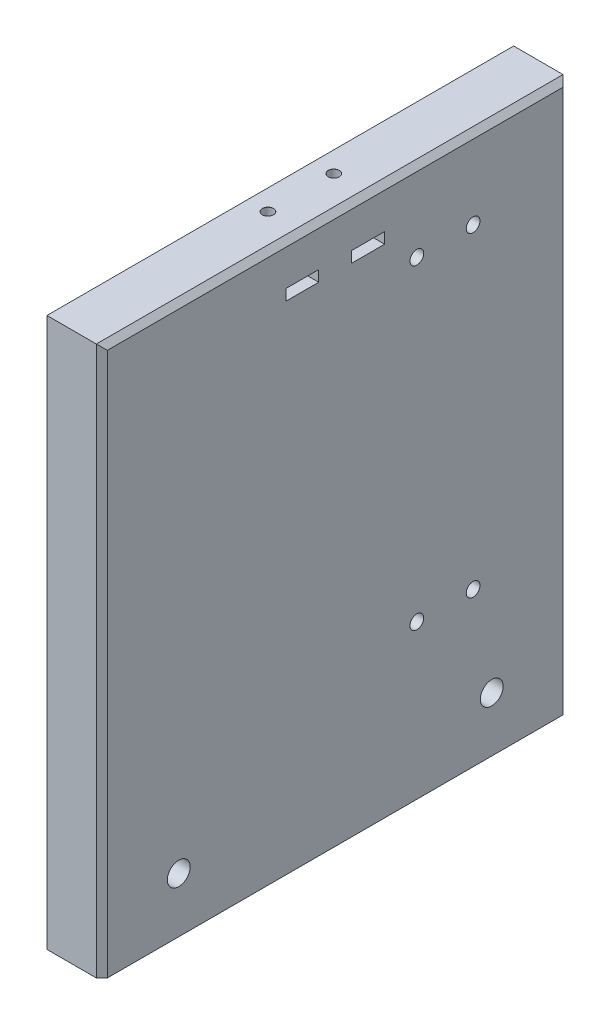
ISO-10303-21;
HEADER;
FILE_DESCRIPTION(('STEP AP214'),'2;1');
FILE_NAME('part.step','',(''),(''),'','','');
FILE_SCHEMA(('AUTOMOTIVE_DESIGN { 1 0 10303 214 1 1 1 1 }'));
ENDSEC;
DATA;
#1=APPLICATION_CONTEXT('core data for automotive mechanical design processes');
#2=APPLICATION_PROTOCOL_DEFINITION('international standard','automotive_design',2000,#1);
#3=PRODUCT_CONTEXT('',#1,'mechanical');
#4=PRODUCT('Part','Part','',(#3));
#5=PRODUCT_RELATED_PRODUCT_CATEGORY('part','',(#4));
#6=PRODUCT_DEFINITION_FORMATION('','',#4);
#7=PRODUCT_DEFINITION_CONTEXT('part definition',#1,'design');
#8=PRODUCT_DEFINITION('design','',#6,#7);
#9=PRODUCT_DEFINITION_SHAPE('','',#8);
#10=(LENGTH_UNIT() NAMED_UNIT(*) SI_UNIT(.MILLI.,.METRE.));
#11=(NAMED_UNIT(*) PLANE_ANGLE_UNIT() SI_UNIT($,.RADIAN.));
#12=(NAMED_UNIT(*) SI_UNIT($,.STERADIAN.) SOLID_ANGLE_UNIT());
#13=UNCERTAINTY_MEASURE_WITH_UNIT(LENGTH_MEASURE(1.E-05),#10,'distance_accuracy_value','');
#14=(GEOMETRIC_REPRESENTATION_CONTEXT(3) GLOBAL_UNCERTAINTY_ASSIGNED_CONTEXT((#13)) GLOBAL_UNIT_ASSIGNED_CONTEXT((#10,
#11,#12)) REPRESENTATION_CONTEXT('',''));
#15=CARTESIAN_POINT('',(0.,0.,0.));
#16=DIRECTION('',(0.,0.,1.));
#17=DIRECTION('',(1.,0.,0.));
#18=AXIS2_PLACEMENT_3D('',#15,#16,#17);
#19=CARTESIAN_POINT('',(-200.,200.,-100.));
#20=DIRECTION('',(1.,0.,0.));
#21=DIRECTION('',(0.,0.,-1.));
#22=AXIS2_PLACEMENT_3D('',#19,#20,#21);
#23=PLANE('',#22);
#24=DIRECTION('',(0.,0.,1.));
#25=VECTOR('',#24,1.);
#26=CARTESIAN_POINT('',(-200.,0.,-100.));
#27=LINE('',#26,#25);
#28=CARTESIAN_POINT('',(-200.,0.,-100.));
#29=VERTEX_POINT('',#28);
#30=CARTESIAN_POINT('',(-200.,0.,70.));
#31=VERTEX_POINT('',#30);
#32=EDGE_CURVE('E274',#29,#31,#27,.T.);
#33=ORIENTED_EDGE('',*,*,#32,.T.);
#34=DIRECTION('',(0.,-1.,0.));
#35=VECTOR('',#34,1.);
#36=CARTESIAN_POINT('',(-200.,200.,70.));
#37=LINE('',#36,#35);
#38=CARTESIAN_POINT('',(-200.,200.,70.));
#39=VERTEX_POINT('',#38);
#40=EDGE_CURVE('E287',#39,#31,#37,.T.);
#41=ORIENTED_EDGE('',*,*,#40,.F.);
#42=DIRECTION('',(0.,0.,1.));
#43=VECTOR('',#42,1.);
#44=CARTESIAN_POINT('',(-200.,200.,-100.));
#45=LINE('',#44,#43);
#46=CARTESIAN_POINT('',(-200.,200.,-100.));
#47=VERTEX_POINT('',#46);
#48=EDGE_CURVE('E264',#47,#39,#45,.T.);
#49=ORIENTED_EDGE('',*,*,#48,.F.);
#50=DIRECTION('',(0.,-1.,0.));
#51=VECTOR('',#50,1.);
#52=CARTESIAN_POINT('',(-200.,200.,-100.));
#53=LINE('',#52,#51);
#54=EDGE_CURVE('E273',#47,#29,#53,.T.);
#55=ORIENTED_EDGE('',*,*,#54,.T.);
#56=EDGE_LOOP('',(#33,#41,#49,#55));
#57=FACE_BOUND('',#56,.T.);
#58=CARTESIAN_POINT('',(-200.,56.,-65.2339028190382));
#59=DIRECTION('',(1.,0.,0.));
#60=DIRECTION('',(0.,0.,-1.));
#61=AXIS2_PLACEMENT_3D('',#58,#59,#60);
#62=CIRCLE('',#61,2.50000000000001);
#63=CARTESIAN_POINT('',(-200.,56.,-67.7339028190382));
#64=VERTEX_POINT('',#63);
#65=EDGE_CURVE('E232',#64,#64,#62,.T.);
#66=ORIENTED_EDGE('',*,*,#65,.T.);
#67=EDGE_LOOP('',(#66));
#68=FACE_BOUND('',#67,.T.);
#69=CARTESIAN_POINT('',(-200.,171.,-44.7368768592372));
#70=DIRECTION('',(1.,0.,0.));
#71=DIRECTION('',(0.,0.,-1.));
#72=AXIS2_PLACEMENT_3D('',#69,#70,#71);
#73=CIRCLE('',#72,2.5);
#74=CARTESIAN_POINT('',(-200.,171.,-47.2368768592372));
#75=VERTEX_POINT('',#74);
#76=EDGE_CURVE('E234',#75,#75,#73,.T.);
#77=ORIENTED_EDGE('',*,*,#76,.T.);
#78=EDGE_LOOP('',(#77));
#79=FACE_BOUND('',#78,.T.);
#80=CARTESIAN_POINT('',(-200.,171.,-65.2339028190381));
#81=DIRECTION('',(1.,0.,0.));
#82=DIRECTION('',(0.,0.,-1.));
#83=AXIS2_PLACEMENT_3D('',#80,#81,#82);
#84=CIRCLE('',#83,2.50000000000001);
#85=CARTESIAN_POINT('',(-200.,171.,-67.7339028190381));
#86=VERTEX_POINT('',#85);
#87=EDGE_CURVE('E237',#86,#86,#84,.T.);
#88=ORIENTED_EDGE('',*,*,#87,.T.);
#89=EDGE_LOOP('',(#88));
#90=FACE_BOUND('',#89,.T.);
#91=CARTESIAN_POINT('',(-200.,19.9898,-72.0167999999993));
#92=DIRECTION('',(1.,0.,0.));
#93=DIRECTION('',(0.,0.,-1.));
#94=AXIS2_PLACEMENT_3D('',#91,#92,#93);
#95=CIRCLE('',#94,4.165);
#96=CARTESIAN_POINT('',(-200.,19.9898,-76.1817999999993));
#97=VERTEX_POINT('',#96);
#98=EDGE_CURVE('E228',#97,#97,#95,.T.);
#99=ORIENTED_EDGE('',*,*,#98,.T.);
#100=EDGE_LOOP('',(#99));
#101=FACE_BOUND('',#100,.T.);
#102=CARTESIAN_POINT('',(-200.,55.9999999999999,-44.7368768592374));
#103=DIRECTION('',(1.,0.,0.));
#104=DIRECTION('',(0.,0.,-1.));
#105=AXIS2_PLACEMENT_3D('',#102,#103,#104);
#106=CIRCLE('',#105,2.50000000000001);
#107=CARTESIAN_POINT('',(-200.,55.9999999999999,-47.2368768592374));
#108=VERTEX_POINT('',#107);
#109=EDGE_CURVE('E229',#108,#108,#106,.T.);
#110=ORIENTED_EDGE('',*,*,#109,.T.);
#111=EDGE_LOOP('',(#110));
#112=FACE_BOUND('',#111,.T.);
#113=CARTESIAN_POINT('',(-200.,19.9898,41.9914000000007));
#114=DIRECTION('',(1.,0.,0.));
#115=DIRECTION('',(0.,0.,-1.));
#116=AXIS2_PLACEMENT_3D('',#113,#114,#115);
#117=CIRCLE('',#116,4.165);
#118=CARTESIAN_POINT('',(-200.,19.9898,37.8264000000007));
#119=VERTEX_POINT('',#118);
#120=EDGE_CURVE('E224',#119,#119,#117,.T.);
#121=ORIENTED_EDGE('',*,*,#120,.T.);
#122=EDGE_LOOP('',(#121));
#123=FACE_BOUND('',#122,.T.);
#124=DIRECTION('',(0.,1.,0.));
#125=VECTOR('',#124,1.);
#126=CARTESIAN_POINT('',(-200.,0.,3.00000000000002));
#127=LINE('',#126,#125);
#128=CARTESIAN_POINT('',(-200.,180.975,3.00000000000002));
#129=VERTEX_POINT('',#128);
#130=CARTESIAN_POINT('',(-200.,184.975,3.00000000000002));
#131=VERTEX_POINT('',#130);
#132=EDGE_CURVE('E202',#129,#131,#127,.T.);
#133=ORIENTED_EDGE('',*,*,#132,.F.);
#134=DIRECTION('',(0.,0.,-1.));
#135=VECTOR('',#134,1.);
#136=CARTESIAN_POINT('',(-200.,180.975,0.));
#137=LINE('',#136,#135);
#138=CARTESIAN_POINT('',(-200.,180.975,-8.99999999999998));
#139=VERTEX_POINT('',#138);
#140=EDGE_CURVE('E192',#129,#139,#137,.T.);
#141=ORIENTED_EDGE('',*,*,#140,.T.);
#142=DIRECTION('',(0.,1.,0.));
#143=VECTOR('',#142,1.);
#144=CARTESIAN_POINT('',(-200.,0.,-8.99999999999998));
#145=LINE('',#144,#143);
#146=CARTESIAN_POINT('',(-200.,184.975,-8.99999999999998));
#147=VERTEX_POINT('',#146);
#148=EDGE_CURVE('E195',#139,#147,#145,.T.);
#149=ORIENTED_EDGE('',*,*,#148,.T.);
#150=DIRECTION('',(0.,0.,-1.));
#151=VECTOR('',#150,1.);
#152=CARTESIAN_POINT('',(-200.,184.975,0.));
#153=LINE('',#152,#151);
#154=EDGE_CURVE('E199',#131,#147,#153,.T.);
#155=ORIENTED_EDGE('',*,*,#154,.F.);
#156=EDGE_LOOP('',(#133,#141,#149,#155));
#157=FACE_BOUND('',#156,.T.);
#158=DIRECTION('',(0.,0.,1.));
#159=VECTOR('',#158,1.);
#160=CARTESIAN_POINT('',(-200.,180.975,-30.0000000000002));
#161=LINE('',#160,#159);
#162=CARTESIAN_POINT('',(-200.,180.975,-33.0000000000002));
#163=VERTEX_POINT('',#162);
#164=CARTESIAN_POINT('',(-200.,180.975,-21.0000000000002));
#165=VERTEX_POINT('',#164);
#166=EDGE_CURVE('E159',#163,#165,#161,.T.);
#167=ORIENTED_EDGE('',*,*,#166,.F.);
#168=DIRECTION('',(0.,1.,0.));
#169=VECTOR('',#168,1.);
#170=CARTESIAN_POINT('',(-200.,0.,-33.0000000000002));
#171=LINE('',#170,#169);
#172=CARTESIAN_POINT('',(-200.,184.975,-33.0000000000002));
#173=VERTEX_POINT('',#172);
#174=EDGE_CURVE('E168',#163,#173,#171,.T.);
#175=ORIENTED_EDGE('',*,*,#174,.T.);
#176=DIRECTION('',(0.,0.,1.));
#177=VECTOR('',#176,1.);
#178=CARTESIAN_POINT('',(-200.,184.975,-30.0000000000002));
#179=LINE('',#178,#177);
#180=CARTESIAN_POINT('',(-200.,184.975,-21.0000000000002));
#181=VERTEX_POINT('',#180);
#182=EDGE_CURVE('E64',#173,#181,#179,.T.);
#183=ORIENTED_EDGE('',*,*,#182,.T.);
#184=DIRECTION('',(0.,1.,0.));
#185=VECTOR('',#184,1.);
#186=CARTESIAN_POINT('',(-200.,0.,-21.0000000000002));
#187=LINE('',#186,#185);
#188=EDGE_CURVE('E165',#165,#181,#187,.T.);
#189=ORIENTED_EDGE('',*,*,#188,.F.);
#190=EDGE_LOOP('',(#167,#175,#183,#189));
#191=FACE_BOUND('',#190,.T.);
#192=ADVANCED_FACE('F46',(#57,#68,#79,#90,#101,#112,#123,#157,#191),#23,.F.);
#193=CARTESIAN_POINT('',(-180.,200.,-100.));
#194=DIRECTION('',(-1.,0.,0.));
#195=DIRECTION('',(0.,0.,1.));
#196=AXIS2_PLACEMENT_3D('',#193,#194,#195);
#197=PLANE('',#196);
#198=DIRECTION('',(0.,0.,-1.));
#199=VECTOR('',#198,1.);
#200=CARTESIAN_POINT('',(-180.,0.,-100.));
#201=LINE('',#200,#199);
#202=CARTESIAN_POINT('',(-180.,0.,68.));
#203=VERTEX_POINT('',#202);
#204=CARTESIAN_POINT('',(-180.,0.,-98.));
#205=VERTEX_POINT('',#204);
#206=EDGE_CURVE('E281',#203,#205,#201,.T.);
#207=ORIENTED_EDGE('',*,*,#206,.T.);
#208=DIRECTION('',(0.,1.,0.));
#209=VECTOR('',#208,1.);
#210=CARTESIAN_POINT('',(-180.,200.,-98.));
#211=LINE('',#210,#209);
#212=CARTESIAN_POINT('',(-180.,198.,-98.));
#213=VERTEX_POINT('',#212);
#214=EDGE_CURVE('E301',#205,#213,#211,.T.);
#215=ORIENTED_EDGE('',*,*,#214,.T.);
#216=DIRECTION('',(0.,0.,1.));
#217=VECTOR('',#216,1.);
#218=CARTESIAN_POINT('',(-180.,198.,70.));
#219=LINE('',#218,#217);
#220=CARTESIAN_POINT('',(-180.,198.,68.));
#221=VERTEX_POINT('',#220);
#222=EDGE_CURVE('E299',#213,#221,#219,.T.);
#223=ORIENTED_EDGE('',*,*,#222,.T.);
#224=DIRECTION('',(0.,-1.,0.));
#225=VECTOR('',#224,1.);
#226=CARTESIAN_POINT('',(-180.,200.,68.));
#227=LINE('',#226,#225);
#228=EDGE_CURVE('E297',#221,#203,#227,.T.);
#229=ORIENTED_EDGE('',*,*,#228,.T.);
#230=EDGE_LOOP('',(#207,#215,#223,#229));
#231=FACE_BOUND('',#230,.T.);
#232=CARTESIAN_POINT('',(-180.,56.,-65.2339028190382));
#233=DIRECTION('',(-1.,0.,0.));
#234=DIRECTION('',(0.,0.,1.));
#235=AXIS2_PLACEMENT_3D('',#232,#233,#234);
#236=CIRCLE('',#235,2.50000000000001);
#237=CARTESIAN_POINT('',(-180.,56.,-62.7339028190382));
#238=VERTEX_POINT('',#237);
#239=EDGE_CURVE('E227',#238,#238,#236,.T.);
#240=ORIENTED_EDGE('',*,*,#239,.T.);
#241=EDGE_LOOP('',(#240));
#242=FACE_BOUND('',#241,.T.);
#243=CARTESIAN_POINT('',(-180.,171.,-44.7368768592372));
#244=DIRECTION('',(-1.,0.,0.));
#245=DIRECTION('',(0.,0.,1.));
#246=AXIS2_PLACEMENT_3D('',#243,#244,#245);
#247=CIRCLE('',#246,2.5);
#248=CARTESIAN_POINT('',(-180.,171.,-42.2368768592372));
#249=VERTEX_POINT('',#248);
#250=EDGE_CURVE('E310',#249,#249,#247,.T.);
#251=ORIENTED_EDGE('',*,*,#250,.T.);
#252=EDGE_LOOP('',(#251));
#253=FACE_BOUND('',#252,.T.);
#254=CARTESIAN_POINT('',(-180.,171.,-65.2339028190381));
#255=DIRECTION('',(-1.,0.,0.));
#256=DIRECTION('',(0.,0.,1.));
#257=AXIS2_PLACEMENT_3D('',#254,#255,#256);
#258=CIRCLE('',#257,2.50000000000001);
#259=CARTESIAN_POINT('',(-180.,171.,-62.733902819038));
#260=VERTEX_POINT('',#259);
#261=EDGE_CURVE('E313',#260,#260,#258,.T.);
#262=ORIENTED_EDGE('',*,*,#261,.T.);
#263=EDGE_LOOP('',(#262));
#264=FACE_BOUND('',#263,.T.);
#265=CARTESIAN_POINT('',(-180.,19.9898,-72.0167999999993));
#266=DIRECTION('',(-1.,0.,0.));
#267=DIRECTION('',(0.,0.,1.));
#268=AXIS2_PLACEMENT_3D('',#265,#266,#267);
#269=CIRCLE('',#268,4.165);
#270=CARTESIAN_POINT('',(-180.,19.9898,-67.8517999999993));
#271=VERTEX_POINT('',#270);
#272=EDGE_CURVE('E316',#271,#271,#269,.T.);
#273=ORIENTED_EDGE('',*,*,#272,.T.);
#274=EDGE_LOOP('',(#273));
#275=FACE_BOUND('',#274,.T.);
#276=CARTESIAN_POINT('',(-180.,55.9999999999999,-44.7368768592374));
#277=DIRECTION('',(-1.,0.,0.));
#278=DIRECTION('',(0.,0.,1.));
#279=AXIS2_PLACEMENT_3D('',#276,#277,#278);
#280=CIRCLE('',#279,2.50000000000001);
#281=CARTESIAN_POINT('',(-180.,55.9999999999999,-42.2368768592374));
#282=VERTEX_POINT('',#281);
#283=EDGE_CURVE('E319',#282,#282,#280,.T.);
#284=ORIENTED_EDGE('',*,*,#283,.T.);
#285=EDGE_LOOP('',(#284));
#286=FACE_BOUND('',#285,.T.);
#287=CARTESIAN_POINT('',(-180.,19.9898,41.9914000000007));
#288=DIRECTION('',(-1.,0.,0.));
#289=DIRECTION('',(0.,0.,1.));
#290=AXIS2_PLACEMENT_3D('',#287,#288,#289);
#291=CIRCLE('',#290,4.165);
#292=CARTESIAN_POINT('',(-180.,19.9898,46.1564000000008));
#293=VERTEX_POINT('',#292);
#294=EDGE_CURVE('E248',#293,#293,#291,.T.);
#295=ORIENTED_EDGE('',*,*,#294,.T.);
#296=EDGE_LOOP('',(#295));
#297=FACE_BOUND('',#296,.T.);
#298=DIRECTION('',(0.,1.,0.));
#299=VECTOR('',#298,1.);
#300=CARTESIAN_POINT('',(-180.,0.,-8.99999999999998));
#301=LINE('',#300,#299);
#302=CARTESIAN_POINT('',(-180.,180.975,-8.99999999999998));
#303=VERTEX_POINT('',#302);
#304=CARTESIAN_POINT('',(-180.,184.975,-8.99999999999998));
#305=VERTEX_POINT('',#304);
#306=EDGE_CURVE('E207',#303,#305,#301,.T.);
#307=ORIENTED_EDGE('',*,*,#306,.F.);
#308=DIRECTION('',(0.,0.,-1.));
#309=VECTOR('',#308,1.);
#310=CARTESIAN_POINT('',(-180.,180.975,0.));
#311=LINE('',#310,#309);
#312=CARTESIAN_POINT('',(-180.,180.975,3.00000000000002));
#313=VERTEX_POINT('',#312);
#314=EDGE_CURVE('E205',#313,#303,#311,.T.);
#315=ORIENTED_EDGE('',*,*,#314,.F.);
#316=DIRECTION('',(0.,1.,0.));
#317=VECTOR('',#316,1.);
#318=CARTESIAN_POINT('',(-180.,0.,3.00000000000002));
#319=LINE('',#318,#317);
#320=CARTESIAN_POINT('',(-180.,184.975,3.00000000000002));
#321=VERTEX_POINT('',#320);
#322=EDGE_CURVE('E196',#313,#321,#319,.T.);
#323=ORIENTED_EDGE('',*,*,#322,.T.);
#324=DIRECTION('',(0.,0.,-1.));
#325=VECTOR('',#324,1.);
#326=CARTESIAN_POINT('',(-180.,184.975,0.));
#327=LINE('',#326,#325);
#328=EDGE_CURVE('E210',#321,#305,#327,.T.);
#329=ORIENTED_EDGE('',*,*,#328,.T.);
#330=EDGE_LOOP('',(#307,#315,#323,#329));
#331=FACE_BOUND('',#330,.T.);
#332=DIRECTION('',(0.,0.,1.));
#333=VECTOR('',#332,1.);
#334=CARTESIAN_POINT('',(-180.,180.975,-30.0000000000002));
#335=LINE('',#334,#333);
#336=CARTESIAN_POINT('',(-180.,180.975,-33.0000000000002));
#337=VERTEX_POINT('',#336);
#338=CARTESIAN_POINT('',(-180.,180.975,-21.0000000000002));
#339=VERTEX_POINT('',#338);
#340=EDGE_CURVE('E72',#337,#339,#335,.T.);
#341=ORIENTED_EDGE('',*,*,#340,.T.);
#342=DIRECTION('',(0.,1.,0.));
#343=VECTOR('',#342,1.);
#344=CARTESIAN_POINT('',(-180.,0.,-21.0000000000002));
#345=LINE('',#344,#343);
#346=CARTESIAN_POINT('',(-180.,184.975,-21.0000000000002));
#347=VERTEX_POINT('',#346);
#348=EDGE_CURVE('E173',#339,#347,#345,.T.);
#349=ORIENTED_EDGE('',*,*,#348,.T.);
#350=DIRECTION('',(0.,0.,1.));
#351=VECTOR('',#350,1.);
#352=CARTESIAN_POINT('',(-180.,184.975,-30.0000000000002));
#353=LINE('',#352,#351);
#354=CARTESIAN_POINT('',(-180.,184.975,-33.0000000000002));
#355=VERTEX_POINT('',#354);
#356=EDGE_CURVE('E176',#355,#347,#353,.T.);
#357=ORIENTED_EDGE('',*,*,#356,.F.);
#358=DIRECTION('',(0.,1.,0.));
#359=VECTOR('',#358,1.);
#360=CARTESIAN_POINT('',(-180.,0.,-33.0000000000002));
#361=LINE('',#360,#359);
#362=EDGE_CURVE('E182',#337,#355,#361,.T.);
#363=ORIENTED_EDGE('',*,*,#362,.F.);
#364=EDGE_LOOP('',(#341,#349,#357,#363));
#365=FACE_BOUND('',#364,.T.);
#366=ADVANCED_FACE('F350',(#231,#242,#253,#264,#275,#286,#297,#331,#365),#197,.F.);
#367=CARTESIAN_POINT('',(-192.5,200.,-2.99999999999998));
#368=DIRECTION('',(0.,1.,0.));
#369=DIRECTION('',(0.,0.,1.));
#370=AXIS2_PLACEMENT_3D('',#367,#368,#369);
#371=CYLINDRICAL_SURFACE('',#370,2.);
#372=CARTESIAN_POINT('',(-192.5,199.975,-2.99999999999998));
#373=DIRECTION('',(0.,1.,0.));
#374=DIRECTION('',(0.,0.,1.));
#375=AXIS2_PLACEMENT_3D('',#372,#373,#374);
#376=CIRCLE('',#375,2.);
#377=CARTESIAN_POINT('',(-192.5,199.975,-0.999999999999977));
#378=VERTEX_POINT('',#377);
#379=EDGE_CURVE('E257',#378,#378,#376,.T.);
#380=ORIENTED_EDGE('',*,*,#379,.T.);
#381=EDGE_LOOP('',(#380));
#382=FACE_BOUND('',#381,.T.);
#383=CARTESIAN_POINT('',(-192.5,184.975,-2.99999999999998));
#384=DIRECTION('',(0.,-1.,0.));
#385=DIRECTION('',(0.,0.,-1.));
#386=AXIS2_PLACEMENT_3D('',#383,#384,#385);
#387=CIRCLE('',#386,2.);
#388=CARTESIAN_POINT('',(-192.5,184.975,-4.99999999999998));
#389=VERTEX_POINT('',#388);
#390=EDGE_CURVE('E217',#389,#389,#387,.F.);
#391=ORIENTED_EDGE('',*,*,#390,.F.);
#392=EDGE_LOOP('',(#391));
#393=FACE_BOUND('',#392,.T.);
#394=ADVANCED_FACE('F356',(#382,#393),#371,.F.);
#395=CARTESIAN_POINT('',(-200.,200.,70.));
#396=DIRECTION('',(0.,0.,-1.));
#397=DIRECTION('',(-1.,0.,0.));
#398=AXIS2_PLACEMENT_3D('',#395,#396,#397);
#399=PLANE('',#398);
#400=DIRECTION('',(1.,0.,0.));
#401=VECTOR('',#400,1.);
#402=CARTESIAN_POINT('',(-200.,0.,70.));
#403=LINE('',#402,#401);
#404=CARTESIAN_POINT('',(-182.,0.,70.));
#405=VERTEX_POINT('',#404);
#406=EDGE_CURVE('E277',#31,#405,#403,.T.);
#407=ORIENTED_EDGE('',*,*,#406,.T.);
#408=DIRECTION('',(0.,1.,0.));
#409=VECTOR('',#408,1.);
#410=CARTESIAN_POINT('',(-182.,200.,70.));
#411=LINE('',#410,#409);
#412=CARTESIAN_POINT('',(-182.,200.,70.));
#413=VERTEX_POINT('',#412);
#414=EDGE_CURVE('E11',#405,#413,#411,.T.);
#415=ORIENTED_EDGE('',*,*,#414,.T.);
#416=DIRECTION('',(1.,0.,0.));
#417=VECTOR('',#416,1.);
#418=CARTESIAN_POINT('',(-200.,200.,70.));
#419=LINE('',#418,#417);
#420=EDGE_CURVE('E267',#39,#413,#419,.T.);
#421=ORIENTED_EDGE('',*,*,#420,.F.);
#422=ORIENTED_EDGE('',*,*,#40,.T.);
#423=EDGE_LOOP('',(#407,#415,#421,#422));
#424=FACE_BOUND('',#423,.T.);
#425=ADVANCED_FACE('F362',(#424),#399,.F.);
#426=CARTESIAN_POINT('',(-200.,200.,-100.));
#427=DIRECTION('',(0.,0.,1.));
#428=DIRECTION('',(1.,0.,0.));
#429=AXIS2_PLACEMENT_3D('',#426,#427,#428);
#430=PLANE('',#429);
#431=DIRECTION('',(-1.,0.,0.));
#432=VECTOR('',#431,1.);
#433=CARTESIAN_POINT('',(-200.,200.,-100.));
#434=LINE('',#433,#432);
#435=CARTESIAN_POINT('',(-182.,200.,-100.));
#436=VERTEX_POINT('',#435);
#437=EDGE_CURVE('E271',#436,#47,#434,.T.);
#438=ORIENTED_EDGE('',*,*,#437,.F.);
#439=DIRECTION('',(0.,-1.,0.));
#440=VECTOR('',#439,1.);
#441=CARTESIAN_POINT('',(-182.,200.,-100.));
#442=LINE('',#441,#440);
#443=CARTESIAN_POINT('',(-182.,0.,-100.));
#444=VERTEX_POINT('',#443);
#445=EDGE_CURVE('E290',#436,#444,#442,.T.);
#446=ORIENTED_EDGE('',*,*,#445,.T.);
#447=DIRECTION('',(-1.,0.,0.));
#448=VECTOR('',#447,1.);
#449=CARTESIAN_POINT('',(-200.,0.,-100.));
#450=LINE('',#449,#448);
#451=EDGE_CURVE('E268',#444,#29,#450,.T.);
#452=ORIENTED_EDGE('',*,*,#451,.T.);
#453=ORIENTED_EDGE('',*,*,#54,.F.);
#454=EDGE_LOOP('',(#438,#446,#452,#453));
#455=FACE_BOUND('',#454,.T.);
#456=ADVANCED_FACE('F396',(#455),#430,.F.);
#457=CARTESIAN_POINT('',(0.,200.,0.));
#458=DIRECTION('',(0.,1.,0.));
#459=DIRECTION('',(0.,0.,1.));
#460=AXIS2_PLACEMENT_3D('',#457,#458,#459);
#461=PLANE('',#460);
#462=CARTESIAN_POINT('',(-192.5,200.,-27.));
#463=DIRECTION('',(0.,1.,0.));
#464=DIRECTION('',(0.,0.,1.));
#465=AXIS2_PLACEMENT_3D('',#462,#463,#464);
#466=CIRCLE('',#465,2.025);
#467=CARTESIAN_POINT('',(-192.5,200.,-24.975));
#468=VERTEX_POINT('',#467);
#469=EDGE_CURVE('E244',#468,#468,#466,.T.);
#470=ORIENTED_EDGE('',*,*,#469,.F.);
#471=EDGE_LOOP('',(#470));
#472=FACE_BOUND('',#471,.T.);
#473=CARTESIAN_POINT('',(-192.5,200.,-2.99999999999998));
#474=DIRECTION('',(0.,1.,0.));
#475=DIRECTION('',(0.,0.,1.));
#476=AXIS2_PLACEMENT_3D('',#473,#474,#475);
#477=CIRCLE('',#476,2.025);
#478=CARTESIAN_POINT('',(-192.5,200.,-0.974999999999979));
#479=VERTEX_POINT('',#478);
#480=EDGE_CURVE('E254',#479,#479,#477,.T.);
#481=ORIENTED_EDGE('',*,*,#480,.F.);
#482=EDGE_LOOP('',(#481));
#483=FACE_BOUND('',#482,.T.);
#484=ORIENTED_EDGE('',*,*,#420,.T.);
#485=DIRECTION('',(0.,0.,-1.));
#486=VECTOR('',#485,1.);
#487=CARTESIAN_POINT('',(-182.,200.,-100.));
#488=LINE('',#487,#486);
#489=EDGE_CURVE('E56',#413,#436,#488,.T.);
#490=ORIENTED_EDGE('',*,*,#489,.T.);
#491=ORIENTED_EDGE('',*,*,#437,.T.);
#492=ORIENTED_EDGE('',*,*,#48,.T.);
#493=EDGE_LOOP('',(#484,#490,#491,#492));
#494=FACE_BOUND('',#493,.T.);
#495=ADVANCED_FACE('F400',(#472,#483,#494),#461,.T.);
#496=CARTESIAN_POINT('',(0.,0.,0.));
#497=DIRECTION('',(0.,1.,0.));
#498=DIRECTION('',(0.,0.,1.));
#499=AXIS2_PLACEMENT_3D('',#496,#497,#498);
#500=PLANE('',#499);
#501=ORIENTED_EDGE('',*,*,#451,.F.);
#502=DIRECTION('',(-0.707106781186552,0.,-0.707106781186543));
#503=VECTOR('',#502,1.);
#504=CARTESIAN_POINT('',(-182.,0.,-100.));
#505=LINE('',#504,#503);
#506=EDGE_CURVE('E295',#444,#205,#505,.F.);
#507=ORIENTED_EDGE('',*,*,#506,.T.);
#508=ORIENTED_EDGE('',*,*,#206,.F.);
#509=DIRECTION('',(0.70710678118655,0.,-0.707106781186545));
#510=VECTOR('',#509,1.);
#511=CARTESIAN_POINT('',(-180.,0.,68.));
#512=LINE('',#511,#510);
#513=EDGE_CURVE('E293',#203,#405,#512,.F.);
#514=ORIENTED_EDGE('',*,*,#513,.T.);
#515=ORIENTED_EDGE('',*,*,#406,.F.);
#516=ORIENTED_EDGE('',*,*,#32,.F.);
#517=EDGE_LOOP('',(#501,#507,#508,#514,#515,#516));
#518=FACE_BOUND('',#517,.T.);
#519=ADVANCED_FACE('F378',(#518),#500,.F.);
#520=CARTESIAN_POINT('',(-180.,200.,68.));
#521=DIRECTION('',(-0.707106781186545,0.,-0.70710678118655));
#522=DIRECTION('',(0.,-1.,0.));
#523=AXIS2_PLACEMENT_3D('',#520,#521,#522);
#524=PLANE('',#523);
#525=ORIENTED_EDGE('',*,*,#513,.F.);
#526=ORIENTED_EDGE('',*,*,#228,.F.);
#527=DIRECTION('',(0.57735026918963,-0.577350269189622,-0.577350269189626));
#528=VECTOR('',#527,1.);
#529=CARTESIAN_POINT('',(-180.666666666667,198.666666666667,68.6666666666667));
#530=LINE('',#529,#528);
#531=EDGE_CURVE('E278',#413,#221,#530,.T.);
#532=ORIENTED_EDGE('',*,*,#531,.F.);
#533=ORIENTED_EDGE('',*,*,#414,.F.);
#534=EDGE_LOOP('',(#525,#526,#532,#533));
#535=FACE_BOUND('',#534,.T.);
#536=ADVANCED_FACE('F49',(#535),#524,.F.);
#537=CARTESIAN_POINT('',(-182.,200.,0.));
#538=DIRECTION('',(0.707106781186542,0.707106781186552,0.));
#539=DIRECTION('',(0.,0.,1.));
#540=AXIS2_PLACEMENT_3D('',#537,#538,#539);
#541=PLANE('',#540);
#542=ORIENTED_EDGE('',*,*,#531,.T.);
#543=ORIENTED_EDGE('',*,*,#222,.F.);
#544=DIRECTION('',(0.577350269189631,-0.577350269189623,0.577350269189623));
#545=VECTOR('',#544,1.);
#546=CARTESIAN_POINT('',(-148.666666666667,166.666666666667,-66.666666666667));
#547=LINE('',#546,#545);
#548=EDGE_CURVE('E263',#436,#213,#547,.T.);
#549=ORIENTED_EDGE('',*,*,#548,.F.);
#550=ORIENTED_EDGE('',*,*,#489,.F.);
#551=EDGE_LOOP('',(#542,#543,#549,#550));
#552=FACE_BOUND('',#551,.T.);
#553=ADVANCED_FACE('F369',(#552),#541,.T.);
#554=CARTESIAN_POINT('',(-182.,200.,-100.));
#555=DIRECTION('',(-0.707106781186542,0.,0.707106781186552));
#556=DIRECTION('',(0.,-1.,0.));
#557=AXIS2_PLACEMENT_3D('',#554,#555,#556);
#558=PLANE('',#557);
#559=ORIENTED_EDGE('',*,*,#548,.T.);
#560=ORIENTED_EDGE('',*,*,#214,.F.);
#561=ORIENTED_EDGE('',*,*,#506,.F.);
#562=ORIENTED_EDGE('',*,*,#445,.F.);
#563=EDGE_LOOP('',(#559,#560,#561,#562));
#564=FACE_BOUND('',#563,.T.);
#565=ADVANCED_FACE('F364',(#564),#558,.F.);
#566=CARTESIAN_POINT('',(-192.5,200.,-2.99999999999998));
#567=DIRECTION('',(0.,1.,0.));
#568=DIRECTION('',(0.,0.,1.));
#569=AXIS2_PLACEMENT_3D('',#566,#567,#568);
#570=CONICAL_SURFACE('',#569,2.025,0.785398163397448);
#571=ORIENTED_EDGE('',*,*,#379,.F.);
#572=EDGE_LOOP('',(#571));
#573=FACE_BOUND('',#572,.T.);
#574=ORIENTED_EDGE('',*,*,#480,.T.);
#575=EDGE_LOOP('',(#574));
#576=FACE_BOUND('',#575,.T.);
#577=ADVANCED_FACE('F348',(#573,#576),#570,.F.);
#578=CARTESIAN_POINT('',(-192.5,200.,-27.));
#579=DIRECTION('',(0.,1.,0.));
#580=DIRECTION('',(0.,0.,1.));
#581=AXIS2_PLACEMENT_3D('',#578,#579,#580);
#582=CYLINDRICAL_SURFACE('',#581,2.);
#583=CARTESIAN_POINT('',(-192.5,184.975,-27.));
#584=DIRECTION('',(0.,1.,0.));
#585=DIRECTION('',(0.,0.,1.));
#586=AXIS2_PLACEMENT_3D('',#583,#584,#585);
#587=CIRCLE('',#586,2.);
#588=CARTESIAN_POINT('',(-192.5,184.975,-25.));
#589=VERTEX_POINT('',#588);
#590=EDGE_CURVE('E188',#589,#589,#587,.F.);
#591=ORIENTED_EDGE('',*,*,#590,.T.);
#592=EDGE_LOOP('',(#591));
#593=FACE_BOUND('',#592,.T.);
#594=CARTESIAN_POINT('',(-192.5,199.975,-27.));
#595=DIRECTION('',(0.,1.,0.));
#596=DIRECTION('',(0.,0.,1.));
#597=AXIS2_PLACEMENT_3D('',#594,#595,#596);
#598=CIRCLE('',#597,2.);
#599=CARTESIAN_POINT('',(-192.5,199.975,-25.));
#600=VERTEX_POINT('',#599);
#601=EDGE_CURVE('E247',#600,#600,#598,.T.);
#602=ORIENTED_EDGE('',*,*,#601,.T.);
#603=EDGE_LOOP('',(#602));
#604=FACE_BOUND('',#603,.T.);
#605=ADVANCED_FACE('F338',(#593,#604),#582,.F.);
#606=CARTESIAN_POINT('',(-192.5,200.,-27.));
#607=DIRECTION('',(0.,1.,0.));
#608=DIRECTION('',(0.,0.,1.));
#609=AXIS2_PLACEMENT_3D('',#606,#607,#608);
#610=CONICAL_SURFACE('',#609,2.025,0.785398163397448);
#611=ORIENTED_EDGE('',*,*,#601,.F.);
#612=EDGE_LOOP('',(#611));
#613=FACE_BOUND('',#612,.T.);
#614=ORIENTED_EDGE('',*,*,#469,.T.);
#615=EDGE_LOOP('',(#614));
#616=FACE_BOUND('',#615,.T.);
#617=ADVANCED_FACE('F347',(#613,#616),#610,.F.);
#618=CARTESIAN_POINT('',(-200.,56.,-65.2339028190382));
#619=DIRECTION('',(1.,0.,0.));
#620=DIRECTION('',(0.,0.,-1.));
#621=AXIS2_PLACEMENT_3D('',#618,#619,#620);
#622=CYLINDRICAL_SURFACE('',#621,2.50000000000001);
#623=ORIENTED_EDGE('',*,*,#65,.F.);
#624=EDGE_LOOP('',(#623));
#625=FACE_BOUND('',#624,.T.);
#626=ORIENTED_EDGE('',*,*,#239,.F.);
#627=EDGE_LOOP('',(#626));
#628=FACE_BOUND('',#627,.T.);
#629=ADVANCED_FACE('F459',(#625,#628),#622,.F.);
#630=CARTESIAN_POINT('',(-200.,171.,-44.7368768592372));
#631=DIRECTION('',(1.,0.,0.));
#632=DIRECTION('',(0.,0.,-1.));
#633=AXIS2_PLACEMENT_3D('',#630,#631,#632);
#634=CYLINDRICAL_SURFACE('',#633,2.5);
#635=ORIENTED_EDGE('',*,*,#76,.F.);
#636=EDGE_LOOP('',(#635));
#637=FACE_BOUND('',#636,.T.);
#638=ORIENTED_EDGE('',*,*,#250,.F.);
#639=EDGE_LOOP('',(#638));
#640=FACE_BOUND('',#639,.T.);
#641=ADVANCED_FACE('F455',(#637,#640),#634,.F.);
#642=CARTESIAN_POINT('',(-200.,171.,-65.2339028190381));
#643=DIRECTION('',(1.,0.,0.));
#644=DIRECTION('',(0.,0.,-1.));
#645=AXIS2_PLACEMENT_3D('',#642,#643,#644);
#646=CYLINDRICAL_SURFACE('',#645,2.50000000000001);
#647=ORIENTED_EDGE('',*,*,#87,.F.);
#648=EDGE_LOOP('',(#647));
#649=FACE_BOUND('',#648,.T.);
#650=ORIENTED_EDGE('',*,*,#261,.F.);
#651=EDGE_LOOP('',(#650));
#652=FACE_BOUND('',#651,.T.);
#653=ADVANCED_FACE('F458',(#649,#652),#646,.F.);
#654=CARTESIAN_POINT('',(-200.,19.9898,-72.0167999999993));
#655=DIRECTION('',(1.,0.,0.));
#656=DIRECTION('',(0.,0.,-1.));
#657=AXIS2_PLACEMENT_3D('',#654,#655,#656);
#658=CYLINDRICAL_SURFACE('',#657,4.165);
#659=ORIENTED_EDGE('',*,*,#98,.F.);
#660=EDGE_LOOP('',(#659));
#661=FACE_BOUND('',#660,.T.);
#662=ORIENTED_EDGE('',*,*,#272,.F.);
#663=EDGE_LOOP('',(#662));
#664=FACE_BOUND('',#663,.T.);
#665=ADVANCED_FACE('F453',(#661,#664),#658,.F.);
#666=CARTESIAN_POINT('',(-200.,55.9999999999999,-44.7368768592374));
#667=DIRECTION('',(1.,0.,0.));
#668=DIRECTION('',(0.,0.,-1.));
#669=AXIS2_PLACEMENT_3D('',#666,#667,#668);
#670=CYLINDRICAL_SURFACE('',#669,2.50000000000001);
#671=ORIENTED_EDGE('',*,*,#109,.F.);
#672=EDGE_LOOP('',(#671));
#673=FACE_BOUND('',#672,.T.);
#674=ORIENTED_EDGE('',*,*,#283,.F.);
#675=EDGE_LOOP('',(#674));
#676=FACE_BOUND('',#675,.T.);
#677=ADVANCED_FACE('F446',(#673,#676),#670,.F.);
#678=CARTESIAN_POINT('',(-200.,19.9898,41.9914000000007));
#679=DIRECTION('',(1.,0.,0.));
#680=DIRECTION('',(0.,0.,-1.));
#681=AXIS2_PLACEMENT_3D('',#678,#679,#680);
#682=CYLINDRICAL_SURFACE('',#681,4.165);
#683=ORIENTED_EDGE('',*,*,#120,.F.);
#684=EDGE_LOOP('',(#683));
#685=FACE_BOUND('',#684,.T.);
#686=ORIENTED_EDGE('',*,*,#294,.F.);
#687=EDGE_LOOP('',(#686));
#688=FACE_BOUND('',#687,.T.);
#689=ADVANCED_FACE('F436',(#685,#688),#682,.F.);
#690=CARTESIAN_POINT('',(-200.,180.975,0.));
#691=DIRECTION('',(0.,-1.,0.));
#692=DIRECTION('',(0.,0.,-1.));
#693=AXIS2_PLACEMENT_3D('',#690,#691,#692);
#694=PLANE('',#693);
#695=ORIENTED_EDGE('',*,*,#314,.T.);
#696=DIRECTION('',(1.,0.,0.));
#697=VECTOR('',#696,1.);
#698=CARTESIAN_POINT('',(-200.,180.975,-8.99999999999998));
#699=LINE('',#698,#697);
#700=EDGE_CURVE('E204',#139,#303,#699,.T.);
#701=ORIENTED_EDGE('',*,*,#700,.F.);
#702=ORIENTED_EDGE('',*,*,#140,.F.);
#703=DIRECTION('',(1.,0.,0.));
#704=VECTOR('',#703,1.);
#705=CARTESIAN_POINT('',(-200.,180.975,3.00000000000002));
#706=LINE('',#705,#704);
#707=EDGE_CURVE('E215',#129,#313,#706,.T.);
#708=ORIENTED_EDGE('',*,*,#707,.T.);
#709=EDGE_LOOP('',(#695,#701,#702,#708));
#710=FACE_BOUND('',#709,.T.);
#711=CARTESIAN_POINT('',(-192.5,180.975,-2.99999999999998));
#712=DIRECTION('',(0.,-1.,0.));
#713=DIRECTION('',(0.,0.,-1.));
#714=AXIS2_PLACEMENT_3D('',#711,#712,#713);
#715=CIRCLE('',#714,2.);
#716=CARTESIAN_POINT('',(-192.5,180.975,-4.99999999999998));
#717=VERTEX_POINT('',#716);
#718=EDGE_CURVE('E233',#717,#717,#715,.F.);
#719=ORIENTED_EDGE('',*,*,#718,.F.);
#720=EDGE_LOOP('',(#719));
#721=FACE_BOUND('',#720,.T.);
#722=ADVANCED_FACE('F433',(#710,#721),#694,.F.);
#723=CARTESIAN_POINT('',(-200.,184.975,0.));
#724=DIRECTION('',(0.,-1.,0.));
#725=DIRECTION('',(0.,0.,-1.));
#726=AXIS2_PLACEMENT_3D('',#723,#724,#725);
#727=PLANE('',#726);
#728=ORIENTED_EDGE('',*,*,#328,.F.);
#729=DIRECTION('',(1.,0.,0.));
#730=VECTOR('',#729,1.);
#731=CARTESIAN_POINT('',(-200.,184.975,3.00000000000002));
#732=LINE('',#731,#730);
#733=EDGE_CURVE('E218',#131,#321,#732,.T.);
#734=ORIENTED_EDGE('',*,*,#733,.F.);
#735=ORIENTED_EDGE('',*,*,#154,.T.);
#736=DIRECTION('',(1.,0.,0.));
#737=VECTOR('',#736,1.);
#738=CARTESIAN_POINT('',(-200.,184.975,-8.99999999999998));
#739=LINE('',#738,#737);
#740=EDGE_CURVE('E220',#147,#305,#739,.T.);
#741=ORIENTED_EDGE('',*,*,#740,.T.);
#742=EDGE_LOOP('',(#728,#734,#735,#741));
#743=FACE_BOUND('',#742,.T.);
#744=ORIENTED_EDGE('',*,*,#390,.T.);
#745=EDGE_LOOP('',(#744));
#746=FACE_BOUND('',#745,.T.);
#747=ADVANCED_FACE('F435',(#743,#746),#727,.T.);
#748=CARTESIAN_POINT('',(-200.,0.,3.00000000000002));
#749=DIRECTION('',(0.,0.,-1.));
#750=DIRECTION('',(-1.,0.,0.));
#751=AXIS2_PLACEMENT_3D('',#748,#749,#750);
#752=PLANE('',#751);
#753=ORIENTED_EDGE('',*,*,#322,.F.);
#754=ORIENTED_EDGE('',*,*,#707,.F.);
#755=ORIENTED_EDGE('',*,*,#132,.T.);
#756=ORIENTED_EDGE('',*,*,#733,.T.);
#757=EDGE_LOOP('',(#753,#754,#755,#756));
#758=FACE_BOUND('',#757,.T.);
#759=ADVANCED_FACE('F443',(#758),#752,.T.);
#760=CARTESIAN_POINT('',(-200.,0.,-8.99999999999998));
#761=DIRECTION('',(0.,0.,-1.));
#762=DIRECTION('',(-1.,0.,0.));
#763=AXIS2_PLACEMENT_3D('',#760,#761,#762);
#764=PLANE('',#763);
#765=ORIENTED_EDGE('',*,*,#306,.T.);
#766=ORIENTED_EDGE('',*,*,#740,.F.);
#767=ORIENTED_EDGE('',*,*,#148,.F.);
#768=ORIENTED_EDGE('',*,*,#700,.T.);
#769=EDGE_LOOP('',(#765,#766,#767,#768));
#770=FACE_BOUND('',#769,.T.);
#771=ADVANCED_FACE('F426',(#770),#764,.F.);
#772=CARTESIAN_POINT('',(-192.5,180.,-2.99999999999998));
#773=DIRECTION('',(0.,1.,0.));
#774=DIRECTION('',(0.,0.,1.));
#775=AXIS2_PLACEMENT_3D('',#772,#773,#774);
#776=CONICAL_SURFACE('',#775,2.,1.02974425867666);
#777=CARTESIAN_POINT('',(-192.5,178.798278761945,-2.99999999999998));
#778=VERTEX_POINT('',#777);
#779=VERTEX_LOOP('',#778);
#780=FACE_BOUND('',#779,.T.);
#781=CARTESIAN_POINT('',(-192.5,180.,-2.99999999999998));
#782=DIRECTION('',(0.,1.,0.));
#783=DIRECTION('',(0.,0.,1.));
#784=AXIS2_PLACEMENT_3D('',#781,#782,#783);
#785=CIRCLE('',#784,2.);
#786=CARTESIAN_POINT('',(-192.5,180.,-0.999999999999977));
#787=VERTEX_POINT('',#786);
#788=EDGE_CURVE('E260',#787,#787,#785,.T.);
#789=ORIENTED_EDGE('',*,*,#788,.T.);
#790=EDGE_LOOP('',(#789));
#791=FACE_BOUND('',#790,.T.);
#792=ADVANCED_FACE('F418',(#780,#791),#776,.F.);
#793=ORIENTED_EDGE('',*,*,#718,.T.);
#794=EDGE_LOOP('',(#793));
#795=FACE_BOUND('',#794,.T.);
#796=ORIENTED_EDGE('',*,*,#788,.F.);
#797=EDGE_LOOP('',(#796));
#798=FACE_BOUND('',#797,.T.);
#799=ADVANCED_FACE('F411',(#795,#798),#371,.F.);
#800=CARTESIAN_POINT('',(-200.,180.975,-30.0000000000002));
#801=DIRECTION('',(0.,1.,0.));
#802=DIRECTION('',(0.,0.,1.));
#803=AXIS2_PLACEMENT_3D('',#800,#801,#802);
#804=PLANE('',#803);
#805=ORIENTED_EDGE('',*,*,#340,.F.);
#806=DIRECTION('',(1.,0.,0.));
#807=VECTOR('',#806,1.);
#808=CARTESIAN_POINT('',(-200.,180.975,-33.0000000000002));
#809=LINE('',#808,#807);
#810=EDGE_CURVE('E154',#163,#337,#809,.T.);
#811=ORIENTED_EDGE('',*,*,#810,.F.);
#812=ORIENTED_EDGE('',*,*,#166,.T.);
#813=DIRECTION('',(1.,0.,0.));
#814=VECTOR('',#813,1.);
#815=CARTESIAN_POINT('',(-200.,180.975,-21.0000000000002));
#816=LINE('',#815,#814);
#817=EDGE_CURVE('E186',#165,#339,#816,.T.);
#818=ORIENTED_EDGE('',*,*,#817,.T.);
#819=EDGE_LOOP('',(#805,#811,#812,#818));
#820=FACE_BOUND('',#819,.T.);
#821=CARTESIAN_POINT('',(-192.5,180.975,-27.));
#822=DIRECTION('',(0.,1.,0.));
#823=DIRECTION('',(0.,0.,1.));
#824=AXIS2_PLACEMENT_3D('',#821,#822,#823);
#825=CIRCLE('',#824,2.);
#826=CARTESIAN_POINT('',(-192.5,180.975,-25.));
#827=VERTEX_POINT('',#826);
#828=EDGE_CURVE('E51',#827,#827,#825,.F.);
#829=ORIENTED_EDGE('',*,*,#828,.T.);
#830=EDGE_LOOP('',(#829));
#831=FACE_BOUND('',#830,.T.);
#832=ADVANCED_FACE('F156',(#820,#831),#804,.T.);
#833=CARTESIAN_POINT('',(-200.,184.975,-30.0000000000002));
#834=DIRECTION('',(0.,1.,0.));
#835=DIRECTION('',(0.,0.,1.));
#836=AXIS2_PLACEMENT_3D('',#833,#834,#835);
#837=PLANE('',#836);
#838=ORIENTED_EDGE('',*,*,#356,.T.);
#839=DIRECTION('',(1.,0.,0.));
#840=VECTOR('',#839,1.);
#841=CARTESIAN_POINT('',(-200.,184.975,-21.0000000000002));
#842=LINE('',#841,#840);
#843=EDGE_CURVE('E189',#181,#347,#842,.T.);
#844=ORIENTED_EDGE('',*,*,#843,.F.);
#845=ORIENTED_EDGE('',*,*,#182,.F.);
#846=DIRECTION('',(1.,0.,0.));
#847=VECTOR('',#846,1.);
#848=CARTESIAN_POINT('',(-200.,184.975,-33.0000000000002));
#849=LINE('',#848,#847);
#850=EDGE_CURVE('E164',#173,#355,#849,.T.);
#851=ORIENTED_EDGE('',*,*,#850,.T.);
#852=EDGE_LOOP('',(#838,#844,#845,#851));
#853=FACE_BOUND('',#852,.T.);
#854=ORIENTED_EDGE('',*,*,#590,.F.);
#855=EDGE_LOOP('',(#854));
#856=FACE_BOUND('',#855,.T.);
#857=ADVANCED_FACE('F424',(#853,#856),#837,.F.);
#858=CARTESIAN_POINT('',(-200.,0.,-21.0000000000002));
#859=DIRECTION('',(0.,0.,-1.));
#860=DIRECTION('',(-1.,0.,0.));
#861=AXIS2_PLACEMENT_3D('',#858,#859,#860);
#862=PLANE('',#861);
#863=ORIENTED_EDGE('',*,*,#348,.F.);
#864=ORIENTED_EDGE('',*,*,#817,.F.);
#865=ORIENTED_EDGE('',*,*,#188,.T.);
#866=ORIENTED_EDGE('',*,*,#843,.T.);
#867=EDGE_LOOP('',(#863,#864,#865,#866));
#868=FACE_BOUND('',#867,.T.);
#869=ADVANCED_FACE('F590',(#868),#862,.T.);
#870=CARTESIAN_POINT('',(-200.,0.,-33.0000000000002));
#871=DIRECTION('',(0.,0.,-1.));
#872=DIRECTION('',(-1.,0.,0.));
#873=AXIS2_PLACEMENT_3D('',#870,#871,#872);
#874=PLANE('',#873);
#875=ORIENTED_EDGE('',*,*,#362,.T.);
#876=ORIENTED_EDGE('',*,*,#850,.F.);
#877=ORIENTED_EDGE('',*,*,#174,.F.);
#878=ORIENTED_EDGE('',*,*,#810,.T.);
#879=EDGE_LOOP('',(#875,#876,#877,#878));
#880=FACE_BOUND('',#879,.T.);
#881=ADVANCED_FACE('F169',(#880),#874,.F.);
#882=CARTESIAN_POINT('',(-192.5,180.,-27.));
#883=DIRECTION('',(0.,1.,0.));
#884=DIRECTION('',(0.,0.,1.));
#885=AXIS2_PLACEMENT_3D('',#882,#883,#884);
#886=CONICAL_SURFACE('',#885,2.,1.02974425867666);
#887=CARTESIAN_POINT('',(-192.5,178.798278761945,-27.));
#888=VERTEX_POINT('',#887);
#889=VERTEX_LOOP('',#888);
#890=FACE_BOUND('',#889,.T.);
#891=CARTESIAN_POINT('',(-192.5,180.,-27.));
#892=DIRECTION('',(0.,1.,0.));
#893=DIRECTION('',(0.,0.,1.));
#894=AXIS2_PLACEMENT_3D('',#891,#892,#893);
#895=CIRCLE('',#894,2.);
#896=CARTESIAN_POINT('',(-192.5,180.,-25.));
#897=VERTEX_POINT('',#896);
#898=EDGE_CURVE('E251',#897,#897,#895,.T.);
#899=ORIENTED_EDGE('',*,*,#898,.T.);
#900=EDGE_LOOP('',(#899));
#901=FACE_BOUND('',#900,.T.);
#902=ADVANCED_FACE('F335',(#890,#901),#886,.F.);
#903=ORIENTED_EDGE('',*,*,#898,.F.);
#904=EDGE_LOOP('',(#903));
#905=FACE_BOUND('',#904,.T.);
#906=ORIENTED_EDGE('',*,*,#828,.F.);
#907=EDGE_LOOP('',(#906));
#908=FACE_BOUND('',#907,.T.);
#909=ADVANCED_FACE('F333',(#905,#908),#582,.F.);
#910=CLOSED_SHELL('',(#192,#366,#394,#425,#456,#495,#519,#536,#553,#565,#577,#605,#617,#629,
#641,#653,#665,#677,#689,#722,#747,#759,#771,#792,#799,#832,#857,#869,#881,#902,#909));
#911=MANIFOLD_SOLID_BREP('B2',#910);
#912=ADVANCED_BREP_SHAPE_REPRESENTATION('',(#18,#911),#14);
#913=SHAPE_DEFINITION_REPRESENTATION(#9,#912);
ENDSEC;
END-ISO-10303-21;
